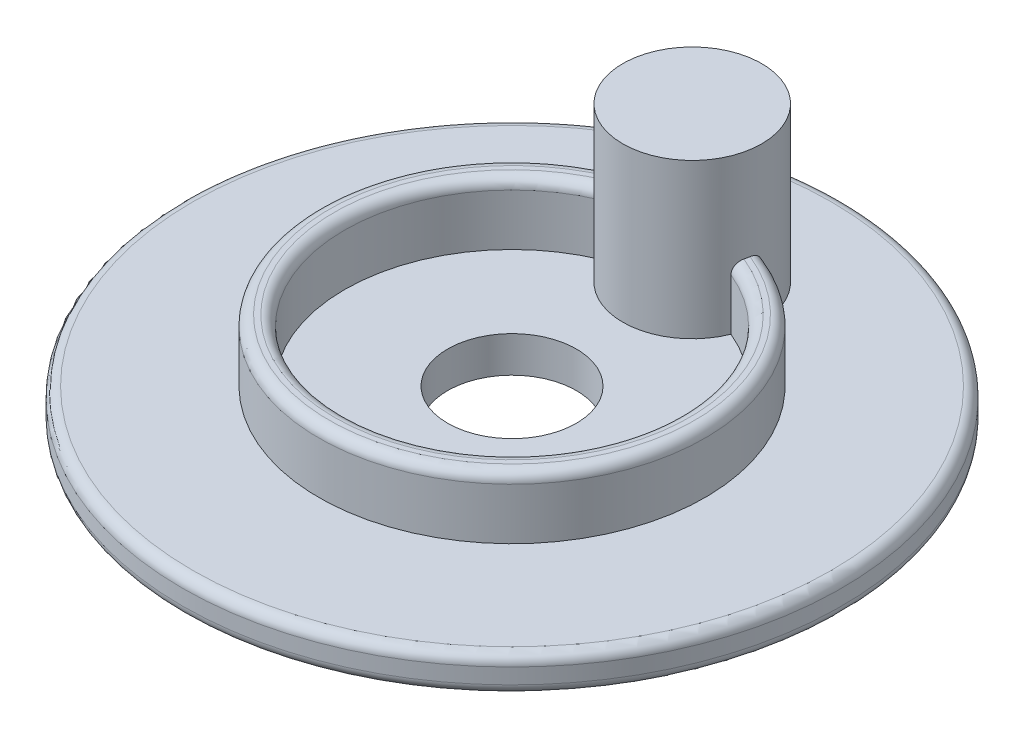
ISO-10303-21;
HEADER;
FILE_DESCRIPTION(('STEP AP214'),'2;1');
FILE_NAME('part.step','',(''),(''),'','','');
FILE_SCHEMA(('AUTOMOTIVE_DESIGN { 1 0 10303 214 1 1 1 1 }'));
ENDSEC;
DATA;
#1=APPLICATION_CONTEXT('core data for automotive mechanical design processes');
#2=APPLICATION_PROTOCOL_DEFINITION('international standard','automotive_design',2000,#1);
#3=PRODUCT_CONTEXT('',#1,'mechanical');
#4=PRODUCT('Part','Part','',(#3));
#5=PRODUCT_RELATED_PRODUCT_CATEGORY('part','',(#4));
#6=PRODUCT_DEFINITION_FORMATION('','',#4);
#7=PRODUCT_DEFINITION_CONTEXT('part definition',#1,'design');
#8=PRODUCT_DEFINITION('design','',#6,#7);
#9=PRODUCT_DEFINITION_SHAPE('','',#8);
#10=(LENGTH_UNIT() NAMED_UNIT(*) SI_UNIT(.MILLI.,.METRE.));
#11=(NAMED_UNIT(*) PLANE_ANGLE_UNIT() SI_UNIT($,.RADIAN.));
#12=(NAMED_UNIT(*) SI_UNIT($,.STERADIAN.) SOLID_ANGLE_UNIT());
#13=UNCERTAINTY_MEASURE_WITH_UNIT(LENGTH_MEASURE(1.E-05),#10,'distance_accuracy_value','');
#14=(GEOMETRIC_REPRESENTATION_CONTEXT(3) GLOBAL_UNCERTAINTY_ASSIGNED_CONTEXT((#13)) GLOBAL_UNIT_ASSIGNED_CONTEXT((#10,
#11,#12)) REPRESENTATION_CONTEXT('',''));
#15=CARTESIAN_POINT('',(0.,0.,0.));
#16=DIRECTION('',(0.,0.,1.));
#17=DIRECTION('',(1.,0.,0.));
#18=AXIS2_PLACEMENT_3D('',#15,#16,#17);
#19=CARTESIAN_POINT('',(0.,19.,0.));
#20=DIRECTION('',(0.,-1.,0.));
#21=DIRECTION('',(0.,0.,-1.));
#22=AXIS2_PLACEMENT_3D('',#19,#20,#21);
#23=CYLINDRICAL_SURFACE('',#22,37.5);
#24=DIRECTION('',(0.,-1.,0.));
#25=VECTOR('',#24,1.);
#26=CARTESIAN_POINT('',(13.4999924414189,22.,-34.9857142857143));
#27=LINE('',#26,#25);
#28=CARTESIAN_POINT('',(13.4999924414189,17.,-34.9857142857143));
#29=VERTEX_POINT('',#28);
#30=CARTESIAN_POINT('',(13.4999924414189,7.,-34.9857142857143));
#31=VERTEX_POINT('',#30);
#32=EDGE_CURVE('E182',#29,#31,#27,.T.);
#33=ORIENTED_EDGE('',*,*,#32,.F.);
#34=CARTESIAN_POINT('',(0.,17.,0.));
#35=DIRECTION('',(0.,1.,0.));
#36=DIRECTION('',(0.,0.,1.));
#37=AXIS2_PLACEMENT_3D('',#34,#35,#36);
#38=CIRCLE('',#37,37.5);
#39=CARTESIAN_POINT('',(-13.4999924414189,17.,-34.9857142857143));
#40=VERTEX_POINT('',#39);
#41=EDGE_CURVE('E128',#29,#40,#38,.F.);
#42=ORIENTED_EDGE('',*,*,#41,.T.);
#43=DIRECTION('',(0.,-1.,0.));
#44=VECTOR('',#43,1.);
#45=CARTESIAN_POINT('',(-13.4999924414189,22.,-34.9857142857143));
#46=LINE('',#45,#44);
#47=CARTESIAN_POINT('',(-13.4999924414189,7.,-34.9857142857143));
#48=VERTEX_POINT('',#47);
#49=EDGE_CURVE('E59',#48,#40,#46,.F.);
#50=ORIENTED_EDGE('',*,*,#49,.F.);
#51=CARTESIAN_POINT('',(0.,7.,0.));
#52=DIRECTION('',(0.,1.,0.));
#53=DIRECTION('',(0.,0.,1.));
#54=AXIS2_PLACEMENT_3D('',#51,#52,#53);
#55=CIRCLE('',#54,37.5);
#56=EDGE_CURVE('E114',#48,#31,#55,.T.);
#57=ORIENTED_EDGE('',*,*,#56,.T.);
#58=EDGE_LOOP('',(#33,#42,#50,#57));
#59=FACE_BOUND('',#58,.T.);
#60=ADVANCED_FACE('F39',(#59),#23,.T.);
#61=CARTESIAN_POINT('',(0.,19.,0.));
#62=DIRECTION('',(0.,-1.,0.));
#63=DIRECTION('',(0.,0.,-1.));
#64=AXIS2_PLACEMENT_3D('',#61,#62,#63);
#65=CYLINDRICAL_SURFACE('',#64,32.5);
#66=CARTESIAN_POINT('',(0.,17.,0.));
#67=DIRECTION('',(0.,1.,0.));
#68=DIRECTION('',(0.,0.,1.));
#69=AXIS2_PLACEMENT_3D('',#66,#67,#68);
#70=CIRCLE('',#69,32.5);
#71=CARTESIAN_POINT('',(-12.5342306814383,17.,-29.9857142857143));
#72=VERTEX_POINT('',#71);
#73=CARTESIAN_POINT('',(12.5342306814383,17.,-29.9857142857143));
#74=VERTEX_POINT('',#73);
#75=EDGE_CURVE('E109',#72,#74,#70,.T.);
#76=ORIENTED_EDGE('',*,*,#75,.T.);
#77=DIRECTION('',(0.,-1.,0.));
#78=VECTOR('',#77,1.);
#79=CARTESIAN_POINT('',(12.5342306814383,22.,-29.9857142857143));
#80=LINE('',#79,#78);
#81=CARTESIAN_POINT('',(12.5342306814383,7.,-29.9857142857143));
#82=VERTEX_POINT('',#81);
#83=EDGE_CURVE('E66',#74,#82,#80,.T.);
#84=ORIENTED_EDGE('',*,*,#83,.T.);
#85=CARTESIAN_POINT('',(0.,7.,0.));
#86=DIRECTION('',(0.,1.,0.));
#87=DIRECTION('',(0.,0.,1.));
#88=AXIS2_PLACEMENT_3D('',#85,#86,#87);
#89=CIRCLE('',#88,32.5);
#90=CARTESIAN_POINT('',(-12.5342306814383,7.,-29.9857142857143));
#91=VERTEX_POINT('',#90);
#92=EDGE_CURVE('E107',#82,#91,#89,.F.);
#93=ORIENTED_EDGE('',*,*,#92,.T.);
#94=DIRECTION('',(0.,-1.,0.));
#95=VECTOR('',#94,1.);
#96=CARTESIAN_POINT('',(-12.5342306814383,22.,-29.9857142857143));
#97=LINE('',#96,#95);
#98=EDGE_CURVE('E98',#91,#72,#97,.F.);
#99=ORIENTED_EDGE('',*,*,#98,.T.);
#100=EDGE_LOOP('',(#76,#84,#93,#99));
#101=FACE_BOUND('',#100,.T.);
#102=ADVANCED_FACE('F106',(#101),#65,.F.);
#103=CARTESIAN_POINT('',(0.,17.,0.));
#104=DIRECTION('',(0.,1.,0.));
#105=DIRECTION('',(0.,0.,1.));
#106=AXIS2_PLACEMENT_3D('',#103,#104,#105);
#107=TOROIDAL_SURFACE('',#106,34.5,2.);
#108=CARTESIAN_POINT('',(0.,19.,0.));
#109=DIRECTION('',(0.,1.,0.));
#110=DIRECTION('',(0.,0.,1.));
#111=AXIS2_PLACEMENT_3D('',#108,#109,#110);
#112=CIRCLE('',#111,34.5);
#113=CARTESIAN_POINT('',(13.1392541645255,19.,-31.9));
#114=VERTEX_POINT('',#113);
#115=CARTESIAN_POINT('',(-13.1392541645255,19.,-31.9));
#116=VERTEX_POINT('',#115);
#117=EDGE_CURVE('E125',#114,#116,#112,.F.);
#118=ORIENTED_EDGE('',*,*,#117,.F.);
#119=CARTESIAN_POINT('',(13.4574158289762,16.9998,-33.9285714181429));
#120=CARTESIAN_POINT('',(13.4574144173344,17.0545056757267,-33.928578843322));
#121=CARTESIAN_POINT('',(13.4572304603151,17.1091844471926,-33.9262404796411));
#122=CARTESIAN_POINT('',(13.4564838598886,17.218131998119,-33.9169142550499));
#123=CARTESIAN_POINT('',(13.4559212822476,17.2724008471276,-33.909927201617));
#124=CARTESIAN_POINT('',(13.4536498283262,17.4337539396021,-33.8821122901966));
#125=CARTESIAN_POINT('',(13.4513573831885,17.5397269979853,-33.8544301241502));
#126=CARTESIAN_POINT('',(13.4449784553747,17.7454532895092,-33.7818612507831));
#127=CARTESIAN_POINT('',(13.4408922087323,17.8452073389934,-33.7369768070862));
#128=CARTESIAN_POINT('',(13.4305739973357,18.0360152113749,-33.6316159779949));
#129=CARTESIAN_POINT('',(13.4243414211031,18.1270665454586,-33.571135150505));
#130=CARTESIAN_POINT('',(13.4091580731518,18.3002378827599,-33.434986634043));
#131=CARTESIAN_POINT('',(13.4001470188815,18.3820985500734,-33.358996233747));
#132=CARTESIAN_POINT('',(13.3790574540853,18.5324223858058,-33.195106525718));
#133=CARTESIAN_POINT('',(13.3669781511551,18.6008820851978,-33.1072041443426));
#134=CARTESIAN_POINT('',(13.3389501789862,18.7249333065295,-32.9187045171992));
#135=CARTESIAN_POINT('',(13.3228792968959,18.7799813003279,-32.8177672257079));
#136=CARTESIAN_POINT('',(13.2869546411496,18.8724741931693,-32.6087507538406));
#137=CARTESIAN_POINT('',(13.2671007797468,18.9099186838267,-32.5006714078416));
#138=CARTESIAN_POINT('',(13.2235226881637,18.9663246851704,-32.27947523551));
#139=CARTESIAN_POINT('',(13.199765923008,18.9851205740949,-32.1663224372503));
#140=CARTESIAN_POINT('',(13.148955175443,19.0029067051528,-31.9391973925251));
#141=CARTESIAN_POINT('',(13.1219014478561,19.0018984769831,-31.8252252100297));
#142=CARTESIAN_POINT('',(13.0657951446087,18.9800619834496,-31.6017579153184));
#143=CARTESIAN_POINT('',(13.0367840589503,18.9595688464566,-31.4922196959342));
#144=CARTESIAN_POINT('',(12.9774833344311,18.8996437962992,-31.2788182771367));
#145=CARTESIAN_POINT('',(12.9471938470116,18.860214120672,-31.1749544088578));
#146=CARTESIAN_POINT('',(12.8872987906026,18.7643786442,-30.9778171956945));
#147=CARTESIAN_POINT('',(12.8576912505481,18.7083130983703,-30.8843788804021));
#148=CARTESIAN_POINT('',(12.8000270425148,18.5804967058315,-30.7083925629165));
#149=CARTESIAN_POINT('',(12.7719702647317,18.5087469714537,-30.6258437890961));
#150=CARTESIAN_POINT('',(12.7190529410507,18.3520954903509,-30.4742834044056));
#151=CARTESIAN_POINT('',(12.6941733633002,18.2672794943705,-30.4051897454779));
#152=CARTESIAN_POINT('',(12.6487563939327,18.0865340347076,-30.2815985996307));
#153=CARTESIAN_POINT('',(12.6282201963043,17.9906015263017,-30.2271051251847));
#154=CARTESIAN_POINT('',(12.5926014063199,17.7900514594601,-30.133903341536));
#155=CARTESIAN_POINT('',(12.5775365423574,17.6854069950348,-30.0952462951689));
#156=CARTESIAN_POINT('',(12.5538444995709,17.4707146581686,-30.0349164781093));
#157=CARTESIAN_POINT('',(12.5452089055412,17.3606740505973,-30.0132215040611));
#158=CARTESIAN_POINT('',(12.5380973871844,17.2081290268839,-29.9953891622806));
#159=CARTESIAN_POINT('',(12.5366460719681,17.1665205228256,-29.9917556546748));
#160=CARTESIAN_POINT('',(12.534713044891,17.0832139548519,-29.9869194799736));
#161=CARTESIAN_POINT('',(12.5342296203805,17.0415161800581,-29.98571251917));
#162=CARTESIAN_POINT('',(12.5342306851531,16.9998,-29.985714295));
#163=B_SPLINE_CURVE_WITH_KNOTS('',3,(#119,#120,#121,#122,#123,#124,#125,#126,#127,#128,#129,
#130,#131,#132,#133,#134,#135,#136,#137,#138,#139,#140,#141,#142,#143,#144,#145,#146,#147,#148,
#149,#150,#151,#152,#153,#154,#155,#156,#157,#158,#159,#160,#161,#162),.UNSPECIFIED.,.F.,.F.,(4,
2,2,2,2,2,2,2,2,2,2,2,2,2,2,2,2,2,2,2,2,4),(0.,0.164013114976911,0.327997748307102,
0.654953654600703,0.98186655198686,1.30887266234879,1.64354277639147,1.97829941020852,
2.32494805147729,2.67160473428877,3.02131329684437,3.37099484753967,3.71476886214648,
4.05850226648402,4.39564011551689,4.73275406229653,5.06774310429607,5.40282411493564,
5.7389813783424,6.07469787165953,6.20001093474513,6.32510206394407),.UNSPECIFIED.);
#164=EDGE_CURVE('E111',#114,#74,#163,.T.);
#165=ORIENTED_EDGE('',*,*,#164,.T.);
#166=ORIENTED_EDGE('',*,*,#75,.F.);
#167=CARTESIAN_POINT('',(-12.5342306851531,16.9998,-29.985714295));
#168=CARTESIAN_POINT('',(-12.5342268697503,17.0560370969131,-29.9857102014814));
#169=CARTESIAN_POINT('',(-12.5351083889939,17.112247504364,-29.9879076817219));
#170=CARTESIAN_POINT('',(-12.5386171632372,17.2242670653584,-29.9966898332425));
#171=CARTESIAN_POINT('',(-12.5412443393752,17.2800762369129,-30.0032743063356));
#172=CARTESIAN_POINT('',(-12.5516963952655,17.4462179749447,-30.0295577193439));
#173=CARTESIAN_POINT('',(-12.5620919513565,17.5554391168735,-30.0557867580812));
#174=CARTESIAN_POINT('',(-12.5891352216796,17.7675921308088,-30.125059934522));
#175=CARTESIAN_POINT('',(-12.6057859806872,17.8705209115369,-30.1681122615214));
#176=CARTESIAN_POINT('',(-12.6443687816386,18.0671541834741,-30.270000660939));
#177=CARTESIAN_POINT('',(-12.6662996704453,18.1608606824676,-30.3288332873889));
#178=CARTESIAN_POINT('',(-12.71417539284,18.3362806307703,-30.4607657656329));
#179=CARTESIAN_POINT('',(-12.7401156037068,18.4180076834803,-30.533849211402));
#180=CARTESIAN_POINT('',(-12.7946190182422,18.5672854145666,-30.6924783656644));
#181=CARTESIAN_POINT('',(-12.8231825229434,18.6348344630349,-30.7780255050751));
#182=CARTESIAN_POINT('',(-12.8813541023824,18.7536392468189,-30.9589970000832));
#183=CARTESIAN_POINT('',(-12.9109582246778,18.8049505009224,-31.0543861877352));
#184=CARTESIAN_POINT('',(-12.9699017117889,18.8902257582849,-31.2526892087434));
#185=CARTESIAN_POINT('',(-12.9992410969053,18.9241911029708,-31.3556024595304));
#186=CARTESIAN_POINT('',(-13.0564582511928,18.9739983135213,-31.5662246489553));
#187=CARTESIAN_POINT('',(-13.0843345102258,18.9898217924573,-31.673938338251));
#188=CARTESIAN_POINT('',(-13.1376245140699,19.003044226538,-31.8910896393815));
#189=CARTESIAN_POINT('',(-13.1630380273819,19.0004414513077,-32.0005274121589));
#190=CARTESIAN_POINT('',(-13.2110676270142,18.9769229859204,-32.219632337999));
#191=CARTESIAN_POINT('',(-13.2336403826622,18.955755665444,-32.3292819056834));
#192=CARTESIAN_POINT('',(-13.2752139476901,18.8955084731271,-32.5442532211605));
#193=CARTESIAN_POINT('',(-13.2942142818322,18.8564262204455,-32.6495743916944));
#194=CARTESIAN_POINT('',(-13.3289403736964,18.7604541276025,-32.8551346096964));
#195=CARTESIAN_POINT('',(-13.3445886847945,18.7032063677102,-32.955219782195));
#196=CARTESIAN_POINT('',(-13.3722800261321,18.5727080043764,-33.1449178755092));
#197=CARTESIAN_POINT('',(-13.3843228762751,18.4994566018528,-33.234530273063));
#198=CARTESIAN_POINT('',(-13.4052345081904,18.33832263572,-33.4010060902396));
#199=CARTESIAN_POINT('',(-13.414083447063,18.2503534113501,-33.477788269201));
#200=CARTESIAN_POINT('',(-13.4289759312037,18.0623815166404,-33.6152952852834));
#201=CARTESIAN_POINT('',(-13.4350190162139,17.962376875458,-33.6760174873054));
#202=CARTESIAN_POINT('',(-13.4446552025307,17.7557533375156,-33.7777863466095));
#203=CARTESIAN_POINT('',(-13.4483045398741,17.6493556567674,-33.819277356271));
#204=CARTESIAN_POINT('',(-13.4537482819707,17.430997184884,-33.8829946601765));
#205=CARTESIAN_POINT('',(-13.455546165058,17.3190472412716,-33.9052570665295));
#206=CARTESIAN_POINT('',(-13.456824590558,17.1718751733412,-33.9211695182661));
#207=CARTESIAN_POINT('',(-13.4570470543442,17.1374912362917,-33.9239491880648));
#208=CARTESIAN_POINT('',(-13.4573426123094,17.0686765089656,-33.9276493397925));
#209=CARTESIAN_POINT('',(-13.4574159386702,17.0342458751527,-33.9285727116391));
#210=CARTESIAN_POINT('',(-13.4574158289763,16.9998,-33.9285714181432));
#211=B_SPLINE_CURVE_WITH_KNOTS('',3,(#167,#168,#169,#170,#171,#172,#173,#174,#175,#176,#177,
#178,#179,#180,#181,#182,#183,#184,#185,#186,#187,#188,#189,#190,#191,#192,#193,#194,#195,#196,
#197,#198,#199,#200,#201,#202,#203,#204,#205,#206,#207,#208,#209,#210),.UNSPECIFIED.,.F.,.F.,(4,
2,2,2,2,2,2,2,2,2,2,2,2,2,2,2,2,2,2,2,2,4),(0.,0.168607732966097,0.337207849425625,
0.673891678436985,1.01073960408894,1.34751403154103,1.68390301780707,2.02033065430595,
2.35559525892231,2.6908339322903,3.02641207326334,3.36202172817174,3.70225190011525,
4.04252730075171,4.3899736564934,4.73743736463633,5.08702405062106,5.43666806077358,
5.77777195553727,6.11823384149522,6.221689479048,6.32498392991242),.UNSPECIFIED.);
#212=EDGE_CURVE('E160',#72,#116,#211,.T.);
#213=ORIENTED_EDGE('',*,*,#212,.T.);
#214=EDGE_LOOP('',(#118,#165,#166,#213));
#215=FACE_BOUND('',#214,.T.);
#216=ADVANCED_FACE('F170',(#215),#107,.T.);
#217=CARTESIAN_POINT('',(0.,17.,0.));
#218=DIRECTION('',(0.,1.,0.));
#219=DIRECTION('',(0.,0.,1.));
#220=AXIS2_PLACEMENT_3D('',#217,#218,#219);
#221=TOROIDAL_SURFACE('',#220,35.5,2.);
#222=ORIENTED_EDGE('',*,*,#41,.F.);
#223=CARTESIAN_POINT('',(13.4999924414076,16.9998,-34.985714275));
#224=CARTESIAN_POINT('',(13.4999899547307,17.0536329745252,-34.9857287238921));
#225=CARTESIAN_POINT('',(13.4999899276816,17.1074619317858,-34.9833972496276));
#226=CARTESIAN_POINT('',(13.4999766332635,17.2147073111454,-34.9741090601479));
#227=CARTESIAN_POINT('',(13.4999633689337,17.2681238250999,-34.9671534067124));
#228=CARTESIAN_POINT('',(13.499905538721,17.3740132564129,-34.9487098217433));
#229=CARTESIAN_POINT('',(13.4998610624664,17.4264884354747,-34.937234909009));
#230=CARTESIAN_POINT('',(13.4997061356343,17.5302664603213,-34.909888940599));
#231=CARTESIAN_POINT('',(13.4995956834144,17.5815692768869,-34.8940177754833));
#232=CARTESIAN_POINT('',(13.4991009478815,17.7331455080814,-34.8400511133429));
#233=CARTESIAN_POINT('',(13.4985534243507,17.8312261073027,-34.7955777571894));
#234=CARTESIAN_POINT('',(13.496571460751,18.018849826176,-34.6913604325385));
#235=CARTESIAN_POINT('',(13.495136596677,18.1083888407102,-34.631609171687));
#236=CARTESIAN_POINT('',(13.4907851678145,18.2798138791902,-34.4965933977191));
#237=CARTESIAN_POINT('',(13.487820341785,18.361340728843,-34.4208742995195));
#238=CARTESIAN_POINT('',(13.4798195699396,18.5114209090165,-34.2576123285346));
#239=CARTESIAN_POINT('',(13.4747829919531,18.5799702702788,-34.1700658522452));
#240=CARTESIAN_POINT('',(13.461787763825,18.7061809248193,-33.9802904275848));
#241=CARTESIAN_POINT('',(13.4536786481031,18.7629967187266,-33.8775084744869));
#242=CARTESIAN_POINT('',(13.434191708356,18.8591602094536,-33.664356522181));
#243=CARTESIAN_POINT('',(13.4228134558381,18.8985056146712,-33.5539855297053));
#244=CARTESIAN_POINT('',(13.3963056625503,18.9593530414738,-33.3259413135855));
#245=CARTESIAN_POINT('',(13.3810921218905,18.980400937157,-33.2081560858591));
#246=CARTESIAN_POINT('',(13.347220150079,19.0021669054666,-32.971199584585));
#247=CARTESIAN_POINT('',(13.3285619207529,19.0028861687747,-32.8520283926245));
#248=CARTESIAN_POINT('',(13.2886712580937,18.9837814867689,-32.6177506991559));
#249=CARTESIAN_POINT('',(13.2674849557477,18.9642871303243,-32.5026096575149));
#250=CARTESIAN_POINT('',(13.2232074306106,18.9054833668645,-32.2778868322746));
#251=CARTESIAN_POINT('',(13.2001165658804,18.8661776773439,-32.1683040099483));
#252=CARTESIAN_POINT('',(13.1539706322896,18.7701503779794,-31.9612532947442));
#253=CARTESIAN_POINT('',(13.1309357892816,18.7139941660639,-31.8635184821903));
#254=CARTESIAN_POINT('',(13.0855537030355,18.5853813846498,-31.6792624018784));
#255=CARTESIAN_POINT('',(13.0632063616116,18.5129271551624,-31.5927395271582));
#256=CARTESIAN_POINT('',(13.021011075757,18.3553202712599,-31.4349149209358));
#257=CARTESIAN_POINT('',(13.001123090462,18.2704408857248,-31.3633507303774));
#258=CARTESIAN_POINT('',(12.9646110233555,18.0893501575886,-31.2352539998953));
#259=CARTESIAN_POINT('',(12.9479876844063,17.993136243793,-31.1787248801307));
#260=CARTESIAN_POINT('',(12.9191651259513,17.7926024562649,-31.0823859589683));
#261=CARTESIAN_POINT('',(12.9069472904254,17.688319007875,-31.0425056901417));
#262=CARTESIAN_POINT('',(12.8876599780105,17.4742977638884,-30.9801366129713));
#263=CARTESIAN_POINT('',(12.8805838414646,17.3645672211266,-30.9576253055681));
#264=CARTESIAN_POINT('',(12.8746783416316,17.2116227676772,-30.9388825083058));
#265=CARTESIAN_POINT('',(12.8734558295233,17.1693203162385,-30.9350102083425));
#266=CARTESIAN_POINT('',(12.871827208792,17.0846180119705,-30.9298560310052));
#267=CARTESIAN_POINT('',(12.8714196463463,17.0422184679216,-30.9285695406765));
#268=CARTESIAN_POINT('',(12.8714206467543,16.9998,-30.9285714381429));
#269=B_SPLINE_CURVE_WITH_KNOTS('',3,(#223,#224,#225,#226,#227,#228,#229,#230,#231,#232,#233,
#234,#235,#236,#237,#238,#239,#240,#241,#242,#243,#244,#245,#246,#247,#248,#249,#250,#251,#252,
#253,#254,#255,#256,#257,#258,#259,#260,#261,#262,#263,#264,#265,#266,#267,#268),.UNSPECIFIED.,
.F.,.F.,(4,2,2,2,2,2,2,2,2,2,2,2,2,2,2,2,2,2,2,2,2,2,4),(0.,0.161440946562061,0.322844836699355,
0.4837871262088,0.644733422571578,0.966206653779078,1.28783361596148,1.62028953473868,
1.95284697385498,2.30439862484178,2.65599637547557,3.01608986065854,3.37616225452467,
3.73045450987586,4.08468030884758,4.4281442754682,4.77155896019543,5.10831913809362,
5.44515585638527,5.78055206976081,6.11551309145407,6.24293635038863,6.37013209013873),.UNSPECIFIED.);
#270=CARTESIAN_POINT('',(13.3356664625358,19.0000000000003,-32.9));
#271=VERTEX_POINT('',#270);
#272=EDGE_CURVE('E12',#29,#271,#269,.T.);
#273=ORIENTED_EDGE('',*,*,#272,.T.);
#274=CARTESIAN_POINT('',(0.,19.,0.));
#275=DIRECTION('',(0.,1.,0.));
#276=DIRECTION('',(0.,0.,1.));
#277=AXIS2_PLACEMENT_3D('',#274,#275,#276);
#278=CIRCLE('',#277,35.5);
#279=CARTESIAN_POINT('',(-13.3356664625357,19.,-32.9));
#280=VERTEX_POINT('',#279);
#281=EDGE_CURVE('E116',#280,#271,#278,.T.);
#282=ORIENTED_EDGE('',*,*,#281,.F.);
#283=CARTESIAN_POINT('',(-12.8714206467543,16.9998,-30.9285714381429));
#284=CARTESIAN_POINT('',(-12.8714171743057,17.0558214967457,-30.9285671117731));
#285=CARTESIAN_POINT('',(-12.8721305543787,17.1118164220704,-30.9308149912982));
#286=CARTESIAN_POINT('',(-12.8749675988924,17.2234066950352,-30.939797781384));
#287=CARTESIAN_POINT('',(-12.8770912019435,17.2790020599623,-30.9465324966247));
#288=CARTESIAN_POINT('',(-12.8855335680313,17.4445051202344,-30.9734132797008));
#289=CARTESIAN_POINT('',(-12.8939240290957,17.5533057994145,-31.000236100277));
#290=CARTESIAN_POINT('',(-12.915676852192,17.7646422109985,-31.0710501117122));
#291=CARTESIAN_POINT('',(-12.9290416876298,17.8671747971435,-31.1150498439719));
#292=CARTESIAN_POINT('',(-12.959854702327,18.0630504522336,-31.2191140166693));
#293=CARTESIAN_POINT('',(-12.9773019302378,18.15639565499,-31.2791747147731));
#294=CARTESIAN_POINT('',(-13.0151360624063,18.3311882433863,-31.4137624534301));
#295=CARTESIAN_POINT('',(-13.0355205469729,18.4126453122822,-31.4882776038329));
#296=CARTESIAN_POINT('',(-13.0779722963667,18.5615029336063,-31.6498355186865));
#297=CARTESIAN_POINT('',(-13.1000397844668,18.6289016165566,-31.7368799466774));
#298=CARTESIAN_POINT('',(-13.1445807006417,18.7478921928802,-31.9212042880693));
#299=CARTESIAN_POINT('',(-13.1670545135254,18.7994681707984,-32.0184943759557));
#300=CARTESIAN_POINT('',(-13.211179960333,18.885468921686,-32.2205381664594));
#301=CARTESIAN_POINT('',(-13.2328316150369,18.919894128406,-32.3252916802467));
#302=CARTESIAN_POINT('',(-13.2745470953848,18.9712112273075,-32.5406187903204));
#303=CARTESIAN_POINT('',(-13.2945898754688,18.9878976183008,-32.6512453363155));
#304=CARTESIAN_POINT('',(-13.3320530902172,19.0028958857205,-32.8741726296029));
#305=CARTESIAN_POINT('',(-13.3494731052434,19.0012048249452,-32.9864736416547));
#306=CARTESIAN_POINT('',(-13.3816651815677,18.9794955424646,-33.2127034841558));
#307=CARTESIAN_POINT('',(-13.3963558738581,18.958998131587,-33.3265978338997));
#308=CARTESIAN_POINT('',(-13.4223692004177,18.899758718818,-33.5499448835898));
#309=CARTESIAN_POINT('',(-13.4336912048825,18.8610133088033,-33.6593967496773));
#310=CARTESIAN_POINT('',(-13.4533917435719,18.7650132139934,-33.8738686714077));
#311=CARTESIAN_POINT('',(-13.4616792875389,18.7072720320959,-33.9786797210964));
#312=CARTESIAN_POINT('',(-13.475283663668,18.5750700140086,-34.1774040742907));
#313=CARTESIAN_POINT('',(-13.4806003214898,18.5006081969627,-34.2713167379911));
#314=CARTESIAN_POINT('',(-13.4888780917181,18.3367250126292,-34.4452370704666));
#315=CARTESIAN_POINT('',(-13.4918386052043,18.2472998487193,-34.5252411997241));
#316=CARTESIAN_POINT('',(-13.496116703207,18.0557244362214,-34.6683666663511));
#317=CARTESIAN_POINT('',(-13.4974342192464,17.953573657449,-34.7314872999624));
#318=CARTESIAN_POINT('',(-13.4990980244909,17.7441677065437,-34.8357875529394));
#319=CARTESIAN_POINT('',(-13.4994841426285,17.6373290739777,-34.8778035801506));
#320=CARTESIAN_POINT('',(-13.4999141032593,17.4179477808811,-34.9419348001987));
#321=CARTESIAN_POINT('',(-13.4999586782838,17.3054178493464,-34.9640924943322));
#322=CARTESIAN_POINT('',(-13.4999838832169,17.1600431580398,-34.9791222671939));
#323=CARTESIAN_POINT('',(-13.4999874462015,17.1280198678336,-34.9815978651276));
#324=CARTESIAN_POINT('',(-13.4999917604785,17.0639357203313,-34.9848931565138));
#325=CARTESIAN_POINT('',(-13.4999925159285,17.0318749889722,-34.9857152976958));
#326=CARTESIAN_POINT('',(-13.4999924414076,16.9998,-34.9857142750002));
#327=B_SPLINE_CURVE_WITH_KNOTS('',3,(#283,#284,#285,#286,#287,#288,#289,#290,#291,#292,#293,
#294,#295,#296,#297,#298,#299,#300,#301,#302,#303,#304,#305,#306,#307,#308,#309,#310,#311,#312,
#313,#314,#315,#316,#317,#318,#319,#320,#321,#322,#323,#324,#325,#326),.UNSPECIFIED.,.F.,.F.,(4,
2,2,2,2,2,2,2,2,2,2,2,2,2,2,2,2,2,2,2,2,4),(0.,0.167961358496068,0.33591540581312,
0.671302160853763,1.00685590337051,1.34233152719845,1.67753235204671,2.01277772337907,
2.34835920790121,2.68393220498634,3.02335175297076,3.36282554995191,3.71119688037144,
4.05963330086135,4.41779638691247,4.7759804888081,5.13425561028377,5.49254566348779,
5.83521929617429,6.17715776665774,6.27348617197007,6.36967187022839),.UNSPECIFIED.);
#328=EDGE_CURVE('E52',#280,#40,#327,.T.);
#329=ORIENTED_EDGE('',*,*,#328,.T.);
#330=EDGE_LOOP('',(#222,#273,#282,#329));
#331=FACE_BOUND('',#330,.T.);
#332=ADVANCED_FACE('F145',(#331),#221,.T.);
#333=CARTESIAN_POINT('',(0.,7.,0.));
#334=DIRECTION('',(0.,-1.,0.));
#335=DIRECTION('',(0.,0.,-1.));
#336=AXIS2_PLACEMENT_3D('',#333,#334,#335);
#337=CYLINDRICAL_SURFACE('',#336,64.);
#338=CARTESIAN_POINT('',(0.,2.,0.));
#339=DIRECTION('',(0.,1.,0.));
#340=DIRECTION('',(0.,0.,1.));
#341=AXIS2_PLACEMENT_3D('',#338,#339,#340);
#342=CIRCLE('',#341,64.);
#343=CARTESIAN_POINT('',(0.,2.,64.));
#344=VERTEX_POINT('',#343);
#345=EDGE_CURVE('E134',#344,#344,#342,.T.);
#346=ORIENTED_EDGE('',*,*,#345,.T.);
#347=EDGE_LOOP('',(#346));
#348=FACE_BOUND('',#347,.T.);
#349=CARTESIAN_POINT('',(0.,5.,0.));
#350=DIRECTION('',(0.,1.,0.));
#351=DIRECTION('',(0.,0.,1.));
#352=AXIS2_PLACEMENT_3D('',#349,#350,#351);
#353=CIRCLE('',#352,64.);
#354=CARTESIAN_POINT('',(0.,5.,64.));
#355=VERTEX_POINT('',#354);
#356=EDGE_CURVE('E131',#355,#355,#353,.F.);
#357=ORIENTED_EDGE('',*,*,#356,.T.);
#358=EDGE_LOOP('',(#357));
#359=FACE_BOUND('',#358,.T.);
#360=ADVANCED_FACE('F175',(#348,#359),#337,.T.);
#361=CARTESIAN_POINT('',(0.,7.,0.));
#362=DIRECTION('',(0.,1.,0.));
#363=DIRECTION('',(0.,0.,1.));
#364=AXIS2_PLACEMENT_3D('',#361,#362,#363);
#365=PLANE('',#364);
#366=CARTESIAN_POINT('',(0.,7.,0.));
#367=DIRECTION('',(0.,1.,0.));
#368=DIRECTION('',(0.,0.,1.));
#369=AXIS2_PLACEMENT_3D('',#366,#367,#368);
#370=CIRCLE('',#369,62.);
#371=CARTESIAN_POINT('',(0.,7.,62.));
#372=VERTEX_POINT('',#371);
#373=EDGE_CURVE('E140',#372,#372,#370,.T.);
#374=ORIENTED_EDGE('',*,*,#373,.T.);
#375=EDGE_LOOP('',(#374));
#376=FACE_BOUND('',#375,.T.);
#377=ORIENTED_EDGE('',*,*,#56,.F.);
#378=CARTESIAN_POINT('',(0.,7.,-35.));
#379=DIRECTION('',(0.,1.,0.));
#380=DIRECTION('',(0.,0.,1.));
#381=AXIS2_PLACEMENT_3D('',#378,#379,#380);
#382=CIRCLE('',#381,13.5);
#383=EDGE_CURVE('E102',#31,#48,#382,.T.);
#384=ORIENTED_EDGE('',*,*,#383,.F.);
#385=EDGE_LOOP('',(#377,#384));
#386=FACE_BOUND('',#385,.T.);
#387=ADVANCED_FACE('F192',(#376,#386),#365,.T.);
#388=CARTESIAN_POINT('',(0.,0.,0.));
#389=DIRECTION('',(0.,1.,0.));
#390=DIRECTION('',(0.,0.,1.));
#391=AXIS2_PLACEMENT_3D('',#388,#389,#390);
#392=PLANE('',#391);
#393=CARTESIAN_POINT('',(0.,0.,0.));
#394=DIRECTION('',(0.,1.,0.));
#395=DIRECTION('',(0.,0.,1.));
#396=AXIS2_PLACEMENT_3D('',#393,#394,#395);
#397=CIRCLE('',#396,62.);
#398=CARTESIAN_POINT('',(0.,0.,62.));
#399=VERTEX_POINT('',#398);
#400=EDGE_CURVE('E137',#399,#399,#397,.F.);
#401=ORIENTED_EDGE('',*,*,#400,.T.);
#402=EDGE_LOOP('',(#401));
#403=FACE_BOUND('',#402,.T.);
#404=CARTESIAN_POINT('',(0.,0.,0.));
#405=DIRECTION('',(0.,1.,0.));
#406=DIRECTION('',(0.,0.,1.));
#407=AXIS2_PLACEMENT_3D('',#404,#405,#406);
#408=CIRCLE('',#407,12.5);
#409=CARTESIAN_POINT('',(0.,0.,12.5));
#410=VERTEX_POINT('',#409);
#411=EDGE_CURVE('E119',#410,#410,#408,.T.);
#412=ORIENTED_EDGE('',*,*,#411,.T.);
#413=EDGE_LOOP('',(#412));
#414=FACE_BOUND('',#413,.T.);
#415=ADVANCED_FACE('F201',(#403,#414),#392,.F.);
#416=CARTESIAN_POINT('',(0.,19.,0.));
#417=DIRECTION('',(0.,1.,0.));
#418=DIRECTION('',(0.,0.,1.));
#419=AXIS2_PLACEMENT_3D('',#416,#417,#418);
#420=PLANE('',#419);
#421=ORIENTED_EDGE('',*,*,#117,.T.);
#422=CARTESIAN_POINT('',(0.,19.,-35.));
#423=DIRECTION('',(0.,1.,0.));
#424=DIRECTION('',(0.,0.,1.));
#425=AXIS2_PLACEMENT_3D('',#422,#423,#424);
#426=CIRCLE('',#425,13.5);
#427=EDGE_CURVE('E167',#116,#280,#426,.F.);
#428=ORIENTED_EDGE('',*,*,#427,.T.);
#429=ORIENTED_EDGE('',*,*,#281,.T.);
#430=EDGE_CURVE('E181',#271,#114,#426,.F.);
#431=ORIENTED_EDGE('',*,*,#430,.T.);
#432=EDGE_LOOP('',(#421,#428,#429,#431));
#433=FACE_BOUND('',#432,.T.);
#434=ADVANCED_FACE('F190',(#433),#420,.T.);
#435=CARTESIAN_POINT('',(0.,7.,0.));
#436=DIRECTION('',(0.,1.,0.));
#437=DIRECTION('',(0.,0.,1.));
#438=AXIS2_PLACEMENT_3D('',#435,#436,#437);
#439=CIRCLE('',#438,12.5);
#440=CARTESIAN_POINT('',(0.,7.,12.5));
#441=VERTEX_POINT('',#440);
#442=EDGE_CURVE('E110',#441,#441,#439,.T.);
#443=ORIENTED_EDGE('',*,*,#442,.F.);
#444=EDGE_LOOP('',(#443));
#445=FACE_BOUND('',#444,.T.);
#446=ORIENTED_EDGE('',*,*,#92,.F.);
#447=EDGE_CURVE('E94',#91,#82,#382,.T.);
#448=ORIENTED_EDGE('',*,*,#447,.F.);
#449=EDGE_LOOP('',(#446,#448));
#450=FACE_BOUND('',#449,.T.);
#451=ADVANCED_FACE('F113',(#445,#450),#365,.T.);
#452=CARTESIAN_POINT('',(0.,0.,0.));
#453=DIRECTION('',(0.,1.,0.));
#454=DIRECTION('',(0.,0.,1.));
#455=AXIS2_PLACEMENT_3D('',#452,#453,#454);
#456=CYLINDRICAL_SURFACE('',#455,12.5);
#457=ORIENTED_EDGE('',*,*,#411,.F.);
#458=EDGE_LOOP('',(#457));
#459=FACE_BOUND('',#458,.T.);
#460=ORIENTED_EDGE('',*,*,#442,.T.);
#461=EDGE_LOOP('',(#460));
#462=FACE_BOUND('',#461,.T.);
#463=ADVANCED_FACE('F153',(#459,#462),#456,.F.);
#464=CARTESIAN_POINT('',(0.,2.,0.));
#465=DIRECTION('',(0.,1.,0.));
#466=DIRECTION('',(0.,0.,1.));
#467=AXIS2_PLACEMENT_3D('',#464,#465,#466);
#468=TOROIDAL_SURFACE('',#467,62.,2.);
#469=ORIENTED_EDGE('',*,*,#400,.F.);
#470=EDGE_LOOP('',(#469));
#471=FACE_BOUND('',#470,.T.);
#472=ORIENTED_EDGE('',*,*,#345,.F.);
#473=EDGE_LOOP('',(#472));
#474=FACE_BOUND('',#473,.T.);
#475=ADVANCED_FACE('F198',(#471,#474),#468,.T.);
#476=CARTESIAN_POINT('',(0.,5.,0.));
#477=DIRECTION('',(0.,1.,0.));
#478=DIRECTION('',(0.,0.,1.));
#479=AXIS2_PLACEMENT_3D('',#476,#477,#478);
#480=TOROIDAL_SURFACE('',#479,62.,2.);
#481=ORIENTED_EDGE('',*,*,#356,.F.);
#482=EDGE_LOOP('',(#481));
#483=FACE_BOUND('',#482,.T.);
#484=ORIENTED_EDGE('',*,*,#373,.F.);
#485=EDGE_LOOP('',(#484));
#486=FACE_BOUND('',#485,.T.);
#487=ADVANCED_FACE('F41',(#483,#486),#480,.T.);
#488=CARTESIAN_POINT('',(0.,37.,-35.));
#489=DIRECTION('',(0.,-1.,0.));
#490=DIRECTION('',(0.,0.,-1.));
#491=AXIS2_PLACEMENT_3D('',#488,#489,#490);
#492=CYLINDRICAL_SURFACE('',#491,13.5);
#493=ORIENTED_EDGE('',*,*,#83,.F.);
#494=ORIENTED_EDGE('',*,*,#164,.F.);
#495=ORIENTED_EDGE('',*,*,#430,.F.);
#496=ORIENTED_EDGE('',*,*,#272,.F.);
#497=ORIENTED_EDGE('',*,*,#32,.T.);
#498=ORIENTED_EDGE('',*,*,#383,.T.);
#499=ORIENTED_EDGE('',*,*,#49,.T.);
#500=ORIENTED_EDGE('',*,*,#328,.F.);
#501=ORIENTED_EDGE('',*,*,#427,.F.);
#502=ORIENTED_EDGE('',*,*,#212,.F.);
#503=ORIENTED_EDGE('',*,*,#98,.F.);
#504=ORIENTED_EDGE('',*,*,#447,.T.);
#505=EDGE_LOOP('',(#493,#494,#495,#496,#497,#498,#499,#500,#501,#502,#503,#504));
#506=FACE_BOUND('',#505,.T.);
#507=CARTESIAN_POINT('',(0.,37.,-35.));
#508=DIRECTION('',(0.,1.,0.));
#509=DIRECTION('',(0.,0.,1.));
#510=AXIS2_PLACEMENT_3D('',#507,#508,#509);
#511=CIRCLE('',#510,13.5);
#512=CARTESIAN_POINT('',(0.,37.,-21.5));
#513=VERTEX_POINT('',#512);
#514=EDGE_CURVE('E222',#513,#513,#511,.T.);
#515=ORIENTED_EDGE('',*,*,#514,.F.);
#516=EDGE_LOOP('',(#515));
#517=FACE_BOUND('',#516,.T.);
#518=ADVANCED_FACE('F95',(#506,#517),#492,.T.);
#519=CARTESIAN_POINT('',(0.,37.,-35.));
#520=DIRECTION('',(0.,1.,0.));
#521=DIRECTION('',(0.,0.,1.));
#522=AXIS2_PLACEMENT_3D('',#519,#520,#521);
#523=PLANE('',#522);
#524=ORIENTED_EDGE('',*,*,#514,.T.);
#525=EDGE_LOOP('',(#524));
#526=FACE_BOUND('',#525,.T.);
#527=ADVANCED_FACE('F152',(#526),#523,.T.);
#528=CLOSED_SHELL('',(#60,#102,#216,#332,#360,#387,#415,#434,#451,#463,#475,#487,#518,#527));
#529=MANIFOLD_SOLID_BREP('B2',#528);
#530=ADVANCED_BREP_SHAPE_REPRESENTATION('',(#18,#529),#14);
#531=SHAPE_DEFINITION_REPRESENTATION(#9,#530);
ENDSEC;
END-ISO-10303-21;
